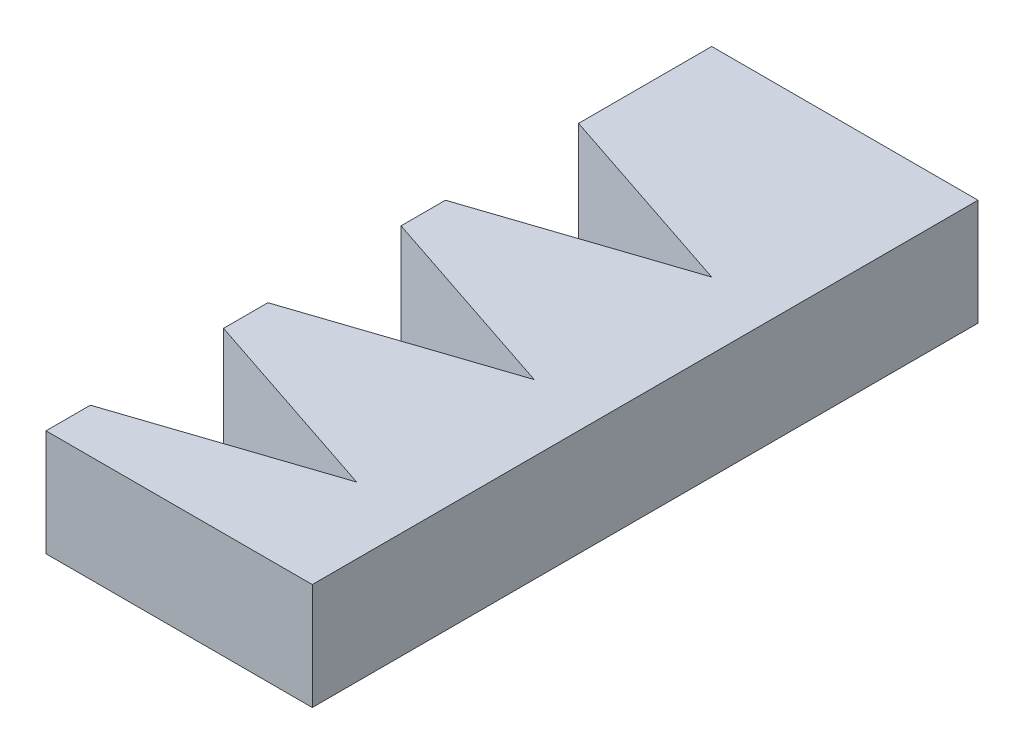
ISO-10303-21;
HEADER;
FILE_DESCRIPTION(('STEP AP214'),'2;1');
FILE_NAME('part.step','',(''),(''),'','','');
FILE_SCHEMA(('AUTOMOTIVE_DESIGN { 1 0 10303 214 1 1 1 1 }'));
ENDSEC;
DATA;
#1=APPLICATION_CONTEXT('core data for automotive mechanical design processes');
#2=APPLICATION_PROTOCOL_DEFINITION('international standard','automotive_design',2000,#1);
#3=PRODUCT_CONTEXT('',#1,'mechanical');
#4=PRODUCT('Part','Part','',(#3));
#5=PRODUCT_RELATED_PRODUCT_CATEGORY('part','',(#4));
#6=PRODUCT_DEFINITION_FORMATION('','',#4);
#7=PRODUCT_DEFINITION_CONTEXT('part definition',#1,'design');
#8=PRODUCT_DEFINITION('design','',#6,#7);
#9=PRODUCT_DEFINITION_SHAPE('','',#8);
#10=(LENGTH_UNIT() NAMED_UNIT(*) SI_UNIT(.MILLI.,.METRE.));
#11=(NAMED_UNIT(*) PLANE_ANGLE_UNIT() SI_UNIT($,.RADIAN.));
#12=(NAMED_UNIT(*) SI_UNIT($,.STERADIAN.) SOLID_ANGLE_UNIT());
#13=UNCERTAINTY_MEASURE_WITH_UNIT(LENGTH_MEASURE(1.E-05),#10,'distance_accuracy_value','');
#14=(GEOMETRIC_REPRESENTATION_CONTEXT(3) GLOBAL_UNCERTAINTY_ASSIGNED_CONTEXT((#13)) GLOBAL_UNIT_ASSIGNED_CONTEXT((#10,
#11,#12)) REPRESENTATION_CONTEXT('',''));
#15=CARTESIAN_POINT('',(0.,0.,0.));
#16=DIRECTION('',(0.,0.,1.));
#17=DIRECTION('',(1.,0.,0.));
#18=AXIS2_PLACEMENT_3D('',#15,#16,#17);
#19=CARTESIAN_POINT('',(0.,12.,0.));
#20=DIRECTION('',(1.,0.,0.));
#21=DIRECTION('',(0.,0.,-1.));
#22=AXIS2_PLACEMENT_3D('',#19,#20,#21);
#23=PLANE('',#22);
#24=DIRECTION('',(0.,-1.,0.));
#25=VECTOR('',#24,1.);
#26=CARTESIAN_POINT('',(0.,39.0416345659799,-40.));
#27=LINE('',#26,#25);
#28=CARTESIAN_POINT('',(0.,12.,-40.));
#29=VERTEX_POINT('',#28);
#30=CARTESIAN_POINT('',(0.,0.,-40.));
#31=VERTEX_POINT('',#30);
#32=EDGE_CURVE('E350',#29,#31,#27,.T.);
#33=ORIENTED_EDGE('',*,*,#32,.F.);
#34=DIRECTION('',(0.,0.,1.));
#35=VECTOR('',#34,1.);
#36=CARTESIAN_POINT('',(0.,12.,0.));
#37=LINE('',#36,#35);
#38=CARTESIAN_POINT('',(0.,12.,-45.));
#39=VERTEX_POINT('',#38);
#40=EDGE_CURVE('E204',#39,#29,#37,.T.);
#41=ORIENTED_EDGE('',*,*,#40,.F.);
#42=DIRECTION('',(0.,-1.,0.));
#43=VECTOR('',#42,1.);
#44=CARTESIAN_POINT('',(0.,39.0416345659799,-45.));
#45=LINE('',#44,#43);
#46=CARTESIAN_POINT('',(0.,0.,-45.));
#47=VERTEX_POINT('',#46);
#48=EDGE_CURVE('E357',#39,#47,#45,.T.);
#49=ORIENTED_EDGE('',*,*,#48,.T.);
#50=DIRECTION('',(0.,0.,1.));
#51=VECTOR('',#50,1.);
#52=CARTESIAN_POINT('',(0.,0.,0.));
#53=LINE('',#52,#51);
#54=EDGE_CURVE('E154',#47,#31,#53,.T.);
#55=ORIENTED_EDGE('',*,*,#54,.T.);
#56=EDGE_LOOP('',(#33,#41,#49,#55));
#57=FACE_BOUND('',#56,.T.);
#58=ADVANCED_FACE('F36',(#57),#23,.F.);
#59=DIRECTION('',(0.,-1.,0.));
#60=VECTOR('',#59,1.);
#61=CARTESIAN_POINT('',(0.,39.0416345659799,-25.));
#62=LINE('',#61,#60);
#63=CARTESIAN_POINT('',(0.,12.,-25.));
#64=VERTEX_POINT('',#63);
#65=CARTESIAN_POINT('',(0.,0.,-25.));
#66=VERTEX_POINT('',#65);
#67=EDGE_CURVE('E134',#64,#66,#62,.T.);
#68=ORIENTED_EDGE('',*,*,#67,.T.);
#69=CARTESIAN_POINT('',(0.,0.,-20.));
#70=VERTEX_POINT('',#69);
#71=EDGE_CURVE('E145',#66,#70,#53,.T.);
#72=ORIENTED_EDGE('',*,*,#71,.T.);
#73=DIRECTION('',(0.,-1.,0.));
#74=VECTOR('',#73,1.);
#75=CARTESIAN_POINT('',(0.,39.0416345659799,-20.));
#76=LINE('',#75,#74);
#77=CARTESIAN_POINT('',(0.,12.,-20.));
#78=VERTEX_POINT('',#77);
#79=EDGE_CURVE('E225',#78,#70,#76,.T.);
#80=ORIENTED_EDGE('',*,*,#79,.F.);
#81=EDGE_CURVE('E147',#64,#78,#37,.T.);
#82=ORIENTED_EDGE('',*,*,#81,.F.);
#83=EDGE_LOOP('',(#68,#72,#80,#82));
#84=FACE_BOUND('',#83,.T.);
#85=ADVANCED_FACE('F143',(#84),#23,.F.);
#86=DIRECTION('',(0.,-1.,0.));
#87=VECTOR('',#86,1.);
#88=CARTESIAN_POINT('',(0.,39.0416345659799,-60.));
#89=LINE('',#88,#87);
#90=CARTESIAN_POINT('',(0.,12.,-60.));
#91=VERTEX_POINT('',#90);
#92=CARTESIAN_POINT('',(0.,0.,-60.));
#93=VERTEX_POINT('',#92);
#94=EDGE_CURVE('E200',#91,#93,#89,.T.);
#95=ORIENTED_EDGE('',*,*,#94,.F.);
#96=CARTESIAN_POINT('',(0.,12.,-75.));
#97=VERTEX_POINT('',#96);
#98=EDGE_CURVE('E199',#97,#91,#37,.T.);
#99=ORIENTED_EDGE('',*,*,#98,.F.);
#100=DIRECTION('',(0.,-1.,0.));
#101=VECTOR('',#100,1.);
#102=CARTESIAN_POINT('',(0.,12.,-75.));
#103=LINE('',#102,#101);
#104=CARTESIAN_POINT('',(0.,0.,-75.));
#105=VERTEX_POINT('',#104);
#106=EDGE_CURVE('E178',#97,#105,#103,.T.);
#107=ORIENTED_EDGE('',*,*,#106,.T.);
#108=EDGE_CURVE('E157',#105,#93,#53,.T.);
#109=ORIENTED_EDGE('',*,*,#108,.T.);
#110=EDGE_LOOP('',(#95,#99,#107,#109));
#111=FACE_BOUND('',#110,.T.);
#112=ADVANCED_FACE('F197',(#111),#23,.F.);
#113=CARTESIAN_POINT('',(0.,12.,0.));
#114=DIRECTION('',(0.,-1.,0.));
#115=DIRECTION('',(0.,0.,-1.));
#116=AXIS2_PLACEMENT_3D('',#113,#114,#115);
#117=PLANE('',#116);
#118=DIRECTION('',(0.948683298050514,0.,0.316227766016838));
#119=VECTOR('',#118,1.);
#120=CARTESIAN_POINT('',(22.5,12.,-32.5));
#121=LINE('',#120,#119);
#122=CARTESIAN_POINT('',(22.5,12.,-32.5));
#123=VERTEX_POINT('',#122);
#124=EDGE_CURVE('E148',#29,#123,#121,.T.);
#125=ORIENTED_EDGE('',*,*,#124,.T.);
#126=DIRECTION('',(-0.948683298050514,0.,0.316227766016838));
#127=VECTOR('',#126,1.);
#128=CARTESIAN_POINT('',(0.,12.,-25.));
#129=LINE('',#128,#127);
#130=EDGE_CURVE('E223',#123,#64,#129,.T.);
#131=ORIENTED_EDGE('',*,*,#130,.T.);
#132=ORIENTED_EDGE('',*,*,#81,.T.);
#133=DIRECTION('',(0.948683298050514,0.,0.316227766016838));
#134=VECTOR('',#133,1.);
#135=CARTESIAN_POINT('',(22.5,12.,-12.5));
#136=LINE('',#135,#134);
#137=CARTESIAN_POINT('',(22.5,12.,-12.5));
#138=VERTEX_POINT('',#137);
#139=EDGE_CURVE('E234',#78,#138,#136,.T.);
#140=ORIENTED_EDGE('',*,*,#139,.T.);
#141=DIRECTION('',(-0.948683298050514,0.,0.316227766016838));
#142=VECTOR('',#141,1.);
#143=CARTESIAN_POINT('',(0.,12.,-5.));
#144=LINE('',#143,#142);
#145=CARTESIAN_POINT('',(0.,12.,-5.));
#146=VERTEX_POINT('',#145);
#147=EDGE_CURVE('E159',#138,#146,#144,.T.);
#148=ORIENTED_EDGE('',*,*,#147,.T.);
#149=CARTESIAN_POINT('',(0.,12.,0.));
#150=VERTEX_POINT('',#149);
#151=EDGE_CURVE('E177',#146,#150,#37,.T.);
#152=ORIENTED_EDGE('',*,*,#151,.T.);
#153=DIRECTION('',(1.,0.,0.));
#154=VECTOR('',#153,1.);
#155=CARTESIAN_POINT('',(0.,12.,0.));
#156=LINE('',#155,#154);
#157=CARTESIAN_POINT('',(30.,12.,0.));
#158=VERTEX_POINT('',#157);
#159=EDGE_CURVE('E203',#150,#158,#156,.T.);
#160=ORIENTED_EDGE('',*,*,#159,.T.);
#161=DIRECTION('',(0.,0.,-1.));
#162=VECTOR('',#161,1.);
#163=CARTESIAN_POINT('',(30.,12.,0.));
#164=LINE('',#163,#162);
#165=CARTESIAN_POINT('',(30.,12.,-75.));
#166=VERTEX_POINT('',#165);
#167=EDGE_CURVE('E188',#158,#166,#164,.T.);
#168=ORIENTED_EDGE('',*,*,#167,.T.);
#169=DIRECTION('',(-1.,0.,0.));
#170=VECTOR('',#169,1.);
#171=CARTESIAN_POINT('',(0.,12.,-75.));
#172=LINE('',#171,#170);
#173=EDGE_CURVE('E181',#166,#97,#172,.T.);
#174=ORIENTED_EDGE('',*,*,#173,.T.);
#175=ORIENTED_EDGE('',*,*,#98,.T.);
#176=DIRECTION('',(0.948683298050514,0.,0.316227766016838));
#177=VECTOR('',#176,1.);
#178=CARTESIAN_POINT('',(22.5,12.,-52.5));
#179=LINE('',#178,#177);
#180=CARTESIAN_POINT('',(22.5,12.,-52.5));
#181=VERTEX_POINT('',#180);
#182=EDGE_CURVE('E359',#91,#181,#179,.T.);
#183=ORIENTED_EDGE('',*,*,#182,.T.);
#184=DIRECTION('',(-0.948683298050514,0.,0.316227766016838));
#185=VECTOR('',#184,1.);
#186=CARTESIAN_POINT('',(0.,12.,-45.));
#187=LINE('',#186,#185);
#188=EDGE_CURVE('E139',#181,#39,#187,.T.);
#189=ORIENTED_EDGE('',*,*,#188,.T.);
#190=ORIENTED_EDGE('',*,*,#40,.T.);
#191=EDGE_LOOP('',(#125,#131,#132,#140,#148,#152,#160,#168,#174,#175,#183,#189,#190));
#192=FACE_BOUND('',#191,.T.);
#193=ADVANCED_FACE('F212',(#192),#117,.F.);
#194=CARTESIAN_POINT('',(0.,0.,0.));
#195=DIRECTION('',(0.,-1.,0.));
#196=DIRECTION('',(0.,0.,-1.));
#197=AXIS2_PLACEMENT_3D('',#194,#195,#196);
#198=PLANE('',#197);
#199=DIRECTION('',(0.948683298050514,0.,-0.316227766016838));
#200=VECTOR('',#199,1.);
#201=CARTESIAN_POINT('',(0.,0.,-25.));
#202=LINE('',#201,#200);
#203=CARTESIAN_POINT('',(22.5,0.,-32.5));
#204=VERTEX_POINT('',#203);
#205=EDGE_CURVE('E131',#66,#204,#202,.T.);
#206=ORIENTED_EDGE('',*,*,#205,.T.);
#207=DIRECTION('',(-0.948683298050514,0.,-0.316227766016838));
#208=VECTOR('',#207,1.);
#209=CARTESIAN_POINT('',(22.5,0.,-32.5));
#210=LINE('',#209,#208);
#211=EDGE_CURVE('E50',#204,#31,#210,.T.);
#212=ORIENTED_EDGE('',*,*,#211,.T.);
#213=ORIENTED_EDGE('',*,*,#54,.F.);
#214=DIRECTION('',(0.948683298050514,0.,-0.316227766016838));
#215=VECTOR('',#214,1.);
#216=CARTESIAN_POINT('',(0.,0.,-45.));
#217=LINE('',#216,#215);
#218=CARTESIAN_POINT('',(22.5,0.,-52.5));
#219=VERTEX_POINT('',#218);
#220=EDGE_CURVE('E366',#47,#219,#217,.T.);
#221=ORIENTED_EDGE('',*,*,#220,.T.);
#222=DIRECTION('',(-0.948683298050514,0.,-0.316227766016838));
#223=VECTOR('',#222,1.);
#224=CARTESIAN_POINT('',(22.5,0.,-52.5));
#225=LINE('',#224,#223);
#226=EDGE_CURVE('E58',#219,#93,#225,.T.);
#227=ORIENTED_EDGE('',*,*,#226,.T.);
#228=ORIENTED_EDGE('',*,*,#108,.F.);
#229=DIRECTION('',(-1.,0.,0.));
#230=VECTOR('',#229,1.);
#231=CARTESIAN_POINT('',(0.,0.,-75.));
#232=LINE('',#231,#230);
#233=CARTESIAN_POINT('',(30.,0.,-75.));
#234=VERTEX_POINT('',#233);
#235=EDGE_CURVE('E173',#234,#105,#232,.T.);
#236=ORIENTED_EDGE('',*,*,#235,.F.);
#237=DIRECTION('',(0.,0.,-1.));
#238=VECTOR('',#237,1.);
#239=CARTESIAN_POINT('',(30.,0.,0.));
#240=LINE('',#239,#238);
#241=CARTESIAN_POINT('',(30.,0.,0.));
#242=VERTEX_POINT('',#241);
#243=EDGE_CURVE('E168',#242,#234,#240,.T.);
#244=ORIENTED_EDGE('',*,*,#243,.F.);
#245=DIRECTION('',(1.,0.,0.));
#246=VECTOR('',#245,1.);
#247=CARTESIAN_POINT('',(0.,0.,0.));
#248=LINE('',#247,#246);
#249=CARTESIAN_POINT('',(0.,0.,0.));
#250=VERTEX_POINT('',#249);
#251=EDGE_CURVE('E163',#250,#242,#248,.T.);
#252=ORIENTED_EDGE('',*,*,#251,.F.);
#253=CARTESIAN_POINT('',(0.,0.,-5.));
#254=VERTEX_POINT('',#253);
#255=EDGE_CURVE('E155',#254,#250,#53,.T.);
#256=ORIENTED_EDGE('',*,*,#255,.F.);
#257=DIRECTION('',(0.948683298050514,0.,-0.316227766016838));
#258=VECTOR('',#257,1.);
#259=CARTESIAN_POINT('',(0.,0.,-5.));
#260=LINE('',#259,#258);
#261=CARTESIAN_POINT('',(22.5,0.,-12.5));
#262=VERTEX_POINT('',#261);
#263=EDGE_CURVE('E220',#254,#262,#260,.T.);
#264=ORIENTED_EDGE('',*,*,#263,.T.);
#265=DIRECTION('',(-0.948683298050514,0.,-0.316227766016838));
#266=VECTOR('',#265,1.);
#267=CARTESIAN_POINT('',(22.5,0.,-12.5));
#268=LINE('',#267,#266);
#269=EDGE_CURVE('E153',#262,#70,#268,.T.);
#270=ORIENTED_EDGE('',*,*,#269,.T.);
#271=ORIENTED_EDGE('',*,*,#71,.F.);
#272=EDGE_LOOP('',(#206,#212,#213,#221,#227,#228,#236,#244,#252,#256,#264,#270,#271));
#273=FACE_BOUND('',#272,.T.);
#274=ADVANCED_FACE('F151',(#273),#198,.T.);
#275=DIRECTION('',(0.,-1.,0.));
#276=VECTOR('',#275,1.);
#277=CARTESIAN_POINT('',(0.,39.0416345659799,-5.));
#278=LINE('',#277,#276);
#279=EDGE_CURVE('E219',#146,#254,#278,.T.);
#280=ORIENTED_EDGE('',*,*,#279,.T.);
#281=ORIENTED_EDGE('',*,*,#255,.T.);
#282=DIRECTION('',(0.,-1.,0.));
#283=VECTOR('',#282,1.);
#284=CARTESIAN_POINT('',(0.,12.,0.));
#285=LINE('',#284,#283);
#286=EDGE_CURVE('E11',#150,#250,#285,.T.);
#287=ORIENTED_EDGE('',*,*,#286,.F.);
#288=ORIENTED_EDGE('',*,*,#151,.F.);
#289=EDGE_LOOP('',(#280,#281,#287,#288));
#290=FACE_BOUND('',#289,.T.);
#291=ADVANCED_FACE('F218',(#290),#23,.F.);
#292=CARTESIAN_POINT('',(0.,12.,0.));
#293=DIRECTION('',(0.,0.,-1.));
#294=DIRECTION('',(-1.,0.,0.));
#295=AXIS2_PLACEMENT_3D('',#292,#293,#294);
#296=PLANE('',#295);
#297=ORIENTED_EDGE('',*,*,#251,.T.);
#298=DIRECTION('',(0.,-1.,0.));
#299=VECTOR('',#298,1.);
#300=CARTESIAN_POINT('',(30.,12.,0.));
#301=LINE('',#300,#299);
#302=EDGE_CURVE('E43',#158,#242,#301,.T.);
#303=ORIENTED_EDGE('',*,*,#302,.F.);
#304=ORIENTED_EDGE('',*,*,#159,.F.);
#305=ORIENTED_EDGE('',*,*,#286,.T.);
#306=EDGE_LOOP('',(#297,#303,#304,#305));
#307=FACE_BOUND('',#306,.T.);
#308=ADVANCED_FACE('F217',(#307),#296,.F.);
#309=CARTESIAN_POINT('',(30.,12.,0.));
#310=DIRECTION('',(-1.,0.,0.));
#311=DIRECTION('',(0.,0.,1.));
#312=AXIS2_PLACEMENT_3D('',#309,#310,#311);
#313=PLANE('',#312);
#314=ORIENTED_EDGE('',*,*,#243,.T.);
#315=DIRECTION('',(0.,-1.,0.));
#316=VECTOR('',#315,1.);
#317=CARTESIAN_POINT('',(30.,12.,-75.));
#318=LINE('',#317,#316);
#319=EDGE_CURVE('E180',#166,#234,#318,.T.);
#320=ORIENTED_EDGE('',*,*,#319,.F.);
#321=ORIENTED_EDGE('',*,*,#167,.F.);
#322=ORIENTED_EDGE('',*,*,#302,.T.);
#323=EDGE_LOOP('',(#314,#320,#321,#322));
#324=FACE_BOUND('',#323,.T.);
#325=ADVANCED_FACE('F186',(#324),#313,.F.);
#326=CARTESIAN_POINT('',(0.,12.,-75.));
#327=DIRECTION('',(0.,0.,1.));
#328=DIRECTION('',(1.,0.,0.));
#329=AXIS2_PLACEMENT_3D('',#326,#327,#328);
#330=PLANE('',#329);
#331=ORIENTED_EDGE('',*,*,#235,.T.);
#332=ORIENTED_EDGE('',*,*,#106,.F.);
#333=ORIENTED_EDGE('',*,*,#173,.F.);
#334=ORIENTED_EDGE('',*,*,#319,.T.);
#335=EDGE_LOOP('',(#331,#332,#333,#334));
#336=FACE_BOUND('',#335,.T.);
#337=ADVANCED_FACE('F194',(#336),#330,.F.);
#338=CARTESIAN_POINT('',(22.5,39.0416345659799,-12.5));
#339=DIRECTION('',(-0.316227766016838,0.,0.948683298050514));
#340=DIRECTION('',(0.948683298050514,0.,0.316227766016838));
#341=AXIS2_PLACEMENT_3D('',#338,#339,#340);
#342=PLANE('',#341);
#343=ORIENTED_EDGE('',*,*,#79,.T.);
#344=ORIENTED_EDGE('',*,*,#269,.F.);
#345=DIRECTION('',(0.,-1.,0.));
#346=VECTOR('',#345,1.);
#347=CARTESIAN_POINT('',(22.5,39.0416345659799,-12.5));
#348=LINE('',#347,#346);
#349=EDGE_CURVE('E232',#138,#262,#348,.T.);
#350=ORIENTED_EDGE('',*,*,#349,.F.);
#351=ORIENTED_EDGE('',*,*,#139,.F.);
#352=EDGE_LOOP('',(#343,#344,#350,#351));
#353=FACE_BOUND('',#352,.T.);
#354=ADVANCED_FACE('F238',(#353),#342,.T.);
#355=CARTESIAN_POINT('',(0.,39.0416345659799,-5.));
#356=DIRECTION('',(-0.316227766016838,0.,-0.948683298050514));
#357=DIRECTION('',(-0.948683298050514,0.,0.316227766016838));
#358=AXIS2_PLACEMENT_3D('',#355,#356,#357);
#359=PLANE('',#358);
#360=ORIENTED_EDGE('',*,*,#349,.T.);
#361=ORIENTED_EDGE('',*,*,#263,.F.);
#362=ORIENTED_EDGE('',*,*,#279,.F.);
#363=ORIENTED_EDGE('',*,*,#147,.F.);
#364=EDGE_LOOP('',(#360,#361,#362,#363));
#365=FACE_BOUND('',#364,.T.);
#366=ADVANCED_FACE('F239',(#365),#359,.T.);
#367=CARTESIAN_POINT('',(22.5,39.0416345659799,-52.5));
#368=DIRECTION('',(-0.316227766016838,0.,0.948683298050514));
#369=DIRECTION('',(0.948683298050514,0.,0.316227766016838));
#370=AXIS2_PLACEMENT_3D('',#367,#368,#369);
#371=PLANE('',#370);
#372=ORIENTED_EDGE('',*,*,#94,.T.);
#373=ORIENTED_EDGE('',*,*,#226,.F.);
#374=DIRECTION('',(0.,-1.,0.));
#375=VECTOR('',#374,1.);
#376=CARTESIAN_POINT('',(22.5,39.0416345659799,-52.5));
#377=LINE('',#376,#375);
#378=EDGE_CURVE('E360',#181,#219,#377,.T.);
#379=ORIENTED_EDGE('',*,*,#378,.F.);
#380=ORIENTED_EDGE('',*,*,#182,.F.);
#381=EDGE_LOOP('',(#372,#373,#379,#380));
#382=FACE_BOUND('',#381,.T.);
#383=ADVANCED_FACE('F241',(#382),#371,.T.);
#384=CARTESIAN_POINT('',(0.,39.0416345659799,-45.));
#385=DIRECTION('',(-0.316227766016838,0.,-0.948683298050514));
#386=DIRECTION('',(-0.948683298050514,0.,0.316227766016838));
#387=AXIS2_PLACEMENT_3D('',#384,#385,#386);
#388=PLANE('',#387);
#389=ORIENTED_EDGE('',*,*,#378,.T.);
#390=ORIENTED_EDGE('',*,*,#220,.F.);
#391=ORIENTED_EDGE('',*,*,#48,.F.);
#392=ORIENTED_EDGE('',*,*,#188,.F.);
#393=EDGE_LOOP('',(#389,#390,#391,#392));
#394=FACE_BOUND('',#393,.T.);
#395=ADVANCED_FACE('F247',(#394),#388,.T.);
#396=CARTESIAN_POINT('',(22.5,39.0416345659799,-32.5));
#397=DIRECTION('',(-0.316227766016838,0.,0.948683298050514));
#398=DIRECTION('',(0.948683298050514,0.,0.316227766016838));
#399=AXIS2_PLACEMENT_3D('',#396,#397,#398);
#400=PLANE('',#399);
#401=ORIENTED_EDGE('',*,*,#32,.T.);
#402=ORIENTED_EDGE('',*,*,#211,.F.);
#403=DIRECTION('',(0.,-1.,0.));
#404=VECTOR('',#403,1.);
#405=CARTESIAN_POINT('',(22.5,39.0416345659799,-32.5));
#406=LINE('',#405,#404);
#407=EDGE_CURVE('E136',#123,#204,#406,.T.);
#408=ORIENTED_EDGE('',*,*,#407,.F.);
#409=ORIENTED_EDGE('',*,*,#124,.F.);
#410=EDGE_LOOP('',(#401,#402,#408,#409));
#411=FACE_BOUND('',#410,.T.);
#412=ADVANCED_FACE('F329',(#411),#400,.T.);
#413=CARTESIAN_POINT('',(0.,39.0416345659799,-25.));
#414=DIRECTION('',(-0.316227766016838,0.,-0.948683298050514));
#415=DIRECTION('',(-0.948683298050514,0.,0.316227766016838));
#416=AXIS2_PLACEMENT_3D('',#413,#414,#415);
#417=PLANE('',#416);
#418=ORIENTED_EDGE('',*,*,#407,.T.);
#419=ORIENTED_EDGE('',*,*,#205,.F.);
#420=ORIENTED_EDGE('',*,*,#67,.F.);
#421=ORIENTED_EDGE('',*,*,#130,.F.);
#422=EDGE_LOOP('',(#418,#419,#420,#421));
#423=FACE_BOUND('',#422,.T.);
#424=ADVANCED_FACE('F133',(#423),#417,.T.);
#425=CLOSED_SHELL('',(#58,#85,#112,#193,#274,#291,#308,#325,#337,#354,#366,#383,#395,#412,#424));
#426=MANIFOLD_SOLID_BREP('B2',#425);
#427=ADVANCED_BREP_SHAPE_REPRESENTATION('',(#18,#426),#14);
#428=SHAPE_DEFINITION_REPRESENTATION(#9,#427);
ENDSEC;
END-ISO-10303-21;
